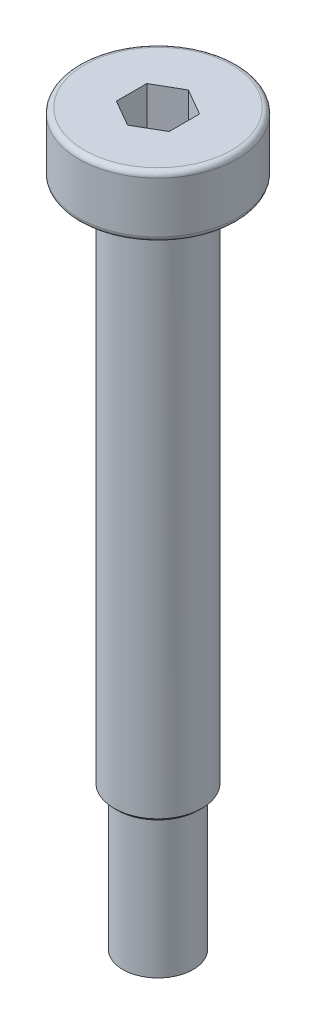
ISO-10303-21;
HEADER;
FILE_DESCRIPTION(('STEP AP214'),'2;1');
FILE_NAME('part.step','',(''),(''),'','','');
FILE_SCHEMA(('AUTOMOTIVE_DESIGN { 1 0 10303 214 1 1 1 1 }'));
ENDSEC;
DATA;
#1=APPLICATION_CONTEXT('core data for automotive mechanical design processes');
#2=APPLICATION_PROTOCOL_DEFINITION('international standard','automotive_design',2000,#1);
#3=PRODUCT_CONTEXT('',#1,'mechanical');
#4=PRODUCT('Part','Part','',(#3));
#5=PRODUCT_RELATED_PRODUCT_CATEGORY('part','',(#4));
#6=PRODUCT_DEFINITION_FORMATION('','',#4);
#7=PRODUCT_DEFINITION_CONTEXT('part definition',#1,'design');
#8=PRODUCT_DEFINITION('design','',#6,#7);
#9=PRODUCT_DEFINITION_SHAPE('','',#8);
#10=(LENGTH_UNIT() NAMED_UNIT(*) SI_UNIT(.MILLI.,.METRE.));
#11=(NAMED_UNIT(*) PLANE_ANGLE_UNIT() SI_UNIT($,.RADIAN.));
#12=(NAMED_UNIT(*) SI_UNIT($,.STERADIAN.) SOLID_ANGLE_UNIT());
#13=UNCERTAINTY_MEASURE_WITH_UNIT(LENGTH_MEASURE(1.E-05),#10,'distance_accuracy_value','');
#14=(GEOMETRIC_REPRESENTATION_CONTEXT(3) GLOBAL_UNCERTAINTY_ASSIGNED_CONTEXT((#13)) GLOBAL_UNIT_ASSIGNED_CONTEXT((#10,
#11,#12)) REPRESENTATION_CONTEXT('',''));
#15=CARTESIAN_POINT('',(0.,0.,0.));
#16=DIRECTION('',(0.,0.,1.));
#17=DIRECTION('',(1.,0.,0.));
#18=AXIS2_PLACEMENT_3D('',#15,#16,#17);
#19=CARTESIAN_POINT('',(0.,3.5,0.));
#20=DIRECTION('',(0.,1.,0.));
#21=DIRECTION('',(-1.,0.,0.));
#22=AXIS2_PLACEMENT_3D('',#19,#20,#21);
#23=PLANE('',#22);
#24=DIRECTION('',(-0.866025403784439,0.,-0.5));
#25=VECTOR('',#24,1.);
#26=CARTESIAN_POINT('',(1.5,3.5,-0.86602540378444));
#27=LINE('',#26,#25);
#28=CARTESIAN_POINT('',(1.5,3.5,-0.86602540378444));
#29=VERTEX_POINT('',#28);
#30=CARTESIAN_POINT('',(0.,3.5,-1.73205080756888));
#31=VERTEX_POINT('',#30);
#32=EDGE_CURVE('E62',#29,#31,#27,.T.);
#33=ORIENTED_EDGE('',*,*,#32,.F.);
#34=DIRECTION('',(0.,0.,-1.));
#35=VECTOR('',#34,1.);
#36=CARTESIAN_POINT('',(1.5,3.5,0.866025403784439));
#37=LINE('',#36,#35);
#38=CARTESIAN_POINT('',(1.5,3.5,0.866025403784439));
#39=VERTEX_POINT('',#38);
#40=EDGE_CURVE('E155',#39,#29,#37,.T.);
#41=ORIENTED_EDGE('',*,*,#40,.F.);
#42=DIRECTION('',(0.866025403784439,0.,-0.5));
#43=VECTOR('',#42,1.);
#44=CARTESIAN_POINT('',(0.,3.5,1.73205080756888));
#45=LINE('',#44,#43);
#46=CARTESIAN_POINT('',(0.,3.5,1.73205080756888));
#47=VERTEX_POINT('',#46);
#48=EDGE_CURVE('E152',#47,#39,#45,.T.);
#49=ORIENTED_EDGE('',*,*,#48,.F.);
#50=DIRECTION('',(0.866025403784438,0.,0.5));
#51=VECTOR('',#50,1.);
#52=CARTESIAN_POINT('',(-1.5,3.5,0.866025403784439));
#53=LINE('',#52,#51);
#54=CARTESIAN_POINT('',(-1.5,3.5,0.866025403784439));
#55=VERTEX_POINT('',#54);
#56=EDGE_CURVE('E110',#55,#47,#53,.T.);
#57=ORIENTED_EDGE('',*,*,#56,.F.);
#58=DIRECTION('',(0.,0.,1.));
#59=VECTOR('',#58,1.);
#60=CARTESIAN_POINT('',(-1.5,3.5,-0.866025403784439));
#61=LINE('',#60,#59);
#62=CARTESIAN_POINT('',(-1.5,3.5,-0.866025403784439));
#63=VERTEX_POINT('',#62);
#64=EDGE_CURVE('E146',#63,#55,#61,.T.);
#65=ORIENTED_EDGE('',*,*,#64,.F.);
#66=DIRECTION('',(-0.866025403784439,0.,0.5));
#67=VECTOR('',#66,1.);
#68=CARTESIAN_POINT('',(0.,3.5,-1.73205080756888));
#69=LINE('',#68,#67);
#70=EDGE_CURVE('E142',#31,#63,#69,.T.);
#71=ORIENTED_EDGE('',*,*,#70,.F.);
#72=EDGE_LOOP('',(#33,#41,#49,#57,#65,#71));
#73=FACE_BOUND('',#72,.T.);
#74=CARTESIAN_POINT('',(0.,3.5,0.));
#75=DIRECTION('',(0.,1.,0.));
#76=DIRECTION('',(-1.,0.,0.));
#77=AXIS2_PLACEMENT_3D('',#74,#75,#76);
#78=CIRCLE('',#77,4.2);
#79=CARTESIAN_POINT('',(-4.2,3.5,0.));
#80=VERTEX_POINT('',#79);
#81=EDGE_CURVE('E194',#80,#80,#78,.T.);
#82=ORIENTED_EDGE('',*,*,#81,.T.);
#83=EDGE_LOOP('',(#82));
#84=FACE_BOUND('',#83,.T.);
#85=ADVANCED_FACE('F45',(#73,#84),#23,.T.);
#86=CARTESIAN_POINT('',(0.,3.5,0.));
#87=DIRECTION('',(0.,1.,0.));
#88=DIRECTION('',(-1.,0.,0.));
#89=AXIS2_PLACEMENT_3D('',#86,#87,#88);
#90=CYLINDRICAL_SURFACE('',#89,4.5);
#91=CARTESIAN_POINT('',(0.,0.3,0.));
#92=DIRECTION('',(0.,-1.,0.));
#93=DIRECTION('',(1.,0.,0.));
#94=AXIS2_PLACEMENT_3D('',#91,#92,#93);
#95=CIRCLE('',#94,4.5);
#96=CARTESIAN_POINT('',(4.5,0.3,0.));
#97=VERTEX_POINT('',#96);
#98=EDGE_CURVE('E186',#97,#97,#95,.F.);
#99=ORIENTED_EDGE('',*,*,#98,.T.);
#100=EDGE_LOOP('',(#99));
#101=FACE_BOUND('',#100,.T.);
#102=CARTESIAN_POINT('',(0.,3.2,0.));
#103=DIRECTION('',(0.,1.,0.));
#104=DIRECTION('',(-1.,0.,0.));
#105=AXIS2_PLACEMENT_3D('',#102,#103,#104);
#106=CIRCLE('',#105,4.5);
#107=CARTESIAN_POINT('',(-4.5,3.2,0.));
#108=VERTEX_POINT('',#107);
#109=EDGE_CURVE('E182',#108,#108,#106,.F.);
#110=ORIENTED_EDGE('',*,*,#109,.T.);
#111=EDGE_LOOP('',(#110));
#112=FACE_BOUND('',#111,.T.);
#113=ADVANCED_FACE('F213',(#101,#112),#90,.T.);
#114=CARTESIAN_POINT('',(-4.5,0.,0.));
#115=DIRECTION('',(0.,-1.,0.));
#116=DIRECTION('',(1.,0.,0.));
#117=AXIS2_PLACEMENT_3D('',#114,#115,#116);
#118=PLANE('',#117);
#119=CARTESIAN_POINT('',(0.,0.,0.));
#120=DIRECTION('',(0.,-1.,0.));
#121=DIRECTION('',(1.,0.,0.));
#122=AXIS2_PLACEMENT_3D('',#119,#120,#121);
#123=CIRCLE('',#122,4.2);
#124=CARTESIAN_POINT('',(4.2,0.,0.));
#125=VERTEX_POINT('',#124);
#126=EDGE_CURVE('E190',#125,#125,#123,.T.);
#127=ORIENTED_EDGE('',*,*,#126,.T.);
#128=EDGE_LOOP('',(#127));
#129=FACE_BOUND('',#128,.T.);
#130=CARTESIAN_POINT('',(0.,0.,0.));
#131=DIRECTION('',(0.,1.,0.));
#132=DIRECTION('',(-1.,0.,0.));
#133=AXIS2_PLACEMENT_3D('',#130,#131,#132);
#134=CIRCLE('',#133,2.5);
#135=CARTESIAN_POINT('',(-2.5,0.,0.));
#136=VERTEX_POINT('',#135);
#137=EDGE_CURVE('E178',#136,#136,#134,.T.);
#138=ORIENTED_EDGE('',*,*,#137,.T.);
#139=EDGE_LOOP('',(#138));
#140=FACE_BOUND('',#139,.T.);
#141=ADVANCED_FACE('F219',(#129,#140),#118,.T.);
#142=CARTESIAN_POINT('',(0.,3.5,0.));
#143=DIRECTION('',(0.,1.,0.));
#144=DIRECTION('',(-1.,0.,0.));
#145=AXIS2_PLACEMENT_3D('',#142,#143,#144);
#146=CYLINDRICAL_SURFACE('',#145,2.5);
#147=CARTESIAN_POINT('',(0.,-29.8,0.));
#148=DIRECTION('',(0.,-1.,0.));
#149=DIRECTION('',(1.,0.,0.));
#150=AXIS2_PLACEMENT_3D('',#147,#148,#149);
#151=CIRCLE('',#150,2.5);
#152=CARTESIAN_POINT('',(2.5,-29.8,0.));
#153=VERTEX_POINT('',#152);
#154=EDGE_CURVE('E55',#153,#153,#151,.F.);
#155=ORIENTED_EDGE('',*,*,#154,.T.);
#156=EDGE_LOOP('',(#155));
#157=FACE_BOUND('',#156,.T.);
#158=ORIENTED_EDGE('',*,*,#137,.F.);
#159=EDGE_LOOP('',(#158));
#160=FACE_BOUND('',#159,.T.);
#161=ADVANCED_FACE('F201',(#157,#160),#146,.T.);
#162=CARTESIAN_POINT('',(-2.5,-30.,0.));
#163=DIRECTION('',(0.,-1.,0.));
#164=DIRECTION('',(1.,0.,0.));
#165=AXIS2_PLACEMENT_3D('',#162,#163,#164);
#166=PLANE('',#165);
#167=CARTESIAN_POINT('',(0.,-30.,0.));
#168=DIRECTION('',(0.,-1.,0.));
#169=DIRECTION('',(1.,0.,0.));
#170=AXIS2_PLACEMENT_3D('',#167,#168,#169);
#171=CIRCLE('',#170,2.3);
#172=CARTESIAN_POINT('',(2.3,-30.,0.));
#173=VERTEX_POINT('',#172);
#174=EDGE_CURVE('E11',#173,#173,#171,.T.);
#175=ORIENTED_EDGE('',*,*,#174,.T.);
#176=EDGE_LOOP('',(#175));
#177=FACE_BOUND('',#176,.T.);
#178=CARTESIAN_POINT('',(0.,-30.,0.));
#179=DIRECTION('',(0.,1.,0.));
#180=DIRECTION('',(-1.,0.,0.));
#181=AXIS2_PLACEMENT_3D('',#178,#179,#180);
#182=CIRCLE('',#181,2.00000000000001);
#183=CARTESIAN_POINT('',(-2.00000000000001,-30.,0.));
#184=VERTEX_POINT('',#183);
#185=EDGE_CURVE('E174',#184,#184,#182,.T.);
#186=ORIENTED_EDGE('',*,*,#185,.T.);
#187=EDGE_LOOP('',(#186));
#188=FACE_BOUND('',#187,.T.);
#189=ADVANCED_FACE('F255',(#177,#188),#166,.T.);
#190=CARTESIAN_POINT('',(0.,3.5,0.));
#191=DIRECTION('',(0.,1.,0.));
#192=DIRECTION('',(-1.,0.,0.));
#193=AXIS2_PLACEMENT_3D('',#190,#191,#192);
#194=CYLINDRICAL_SURFACE('',#193,2.00000000000001);
#195=CARTESIAN_POINT('',(0.,-38.,0.));
#196=DIRECTION('',(0.,1.,0.));
#197=DIRECTION('',(-1.,0.,0.));
#198=AXIS2_PLACEMENT_3D('',#195,#196,#197);
#199=CIRCLE('',#198,2.00000000000001);
#200=CARTESIAN_POINT('',(-2.00000000000001,-38.,0.));
#201=VERTEX_POINT('',#200);
#202=EDGE_CURVE('E161',#201,#201,#199,.T.);
#203=ORIENTED_EDGE('',*,*,#202,.T.);
#204=EDGE_LOOP('',(#203));
#205=FACE_BOUND('',#204,.T.);
#206=ORIENTED_EDGE('',*,*,#185,.F.);
#207=EDGE_LOOP('',(#206));
#208=FACE_BOUND('',#207,.T.);
#209=ADVANCED_FACE('F251',(#205,#208),#194,.T.);
#210=CARTESIAN_POINT('',(-2.00000000000001,-38.,0.));
#211=DIRECTION('',(0.,-1.,0.));
#212=DIRECTION('',(1.,0.,0.));
#213=AXIS2_PLACEMENT_3D('',#210,#211,#212);
#214=PLANE('',#213);
#215=ORIENTED_EDGE('',*,*,#202,.F.);
#216=EDGE_LOOP('',(#215));
#217=FACE_BOUND('',#216,.T.);
#218=ADVANCED_FACE('F228',(#217),#214,.T.);
#219=CARTESIAN_POINT('',(0.,0.3,0.));
#220=DIRECTION('',(0.,-1.,0.));
#221=DIRECTION('',(1.,0.,0.));
#222=AXIS2_PLACEMENT_3D('',#219,#220,#221);
#223=TOROIDAL_SURFACE('',#222,4.2,0.3);
#224=ORIENTED_EDGE('',*,*,#126,.F.);
#225=EDGE_LOOP('',(#224));
#226=FACE_BOUND('',#225,.T.);
#227=ORIENTED_EDGE('',*,*,#98,.F.);
#228=EDGE_LOOP('',(#227));
#229=FACE_BOUND('',#228,.T.);
#230=ADVANCED_FACE('F225',(#226,#229),#223,.T.);
#231=CARTESIAN_POINT('',(0.,3.2,0.));
#232=DIRECTION('',(0.,1.,0.));
#233=DIRECTION('',(-1.,0.,0.));
#234=AXIS2_PLACEMENT_3D('',#231,#232,#233);
#235=TOROIDAL_SURFACE('',#234,4.2,0.3);
#236=ORIENTED_EDGE('',*,*,#109,.F.);
#237=EDGE_LOOP('',(#236));
#238=FACE_BOUND('',#237,.T.);
#239=ORIENTED_EDGE('',*,*,#81,.F.);
#240=EDGE_LOOP('',(#239));
#241=FACE_BOUND('',#240,.T.);
#242=ADVANCED_FACE('F227',(#238,#241),#235,.T.);
#243=CARTESIAN_POINT('',(1.5,1.1,-0.86602540378444));
#244=DIRECTION('',(0.5,0.,-0.866025403784439));
#245=DIRECTION('',(-0.866025403784439,0.,-0.5));
#246=AXIS2_PLACEMENT_3D('',#243,#244,#245);
#247=PLANE('',#246);
#248=ORIENTED_EDGE('',*,*,#32,.T.);
#249=DIRECTION('',(0.,1.,0.));
#250=VECTOR('',#249,1.);
#251=CARTESIAN_POINT('',(0.,1.1,-1.73205080756888));
#252=LINE('',#251,#250);
#253=CARTESIAN_POINT('',(0.,1.1,-1.73205080756888));
#254=VERTEX_POINT('',#253);
#255=EDGE_CURVE('E92',#254,#31,#252,.T.);
#256=ORIENTED_EDGE('',*,*,#255,.F.);
#257=DIRECTION('',(-0.866025403784439,0.,-0.5));
#258=VECTOR('',#257,1.);
#259=CARTESIAN_POINT('',(1.5,1.1,-0.86602540378444));
#260=LINE('',#259,#258);
#261=CARTESIAN_POINT('',(1.5,1.1,-0.86602540378444));
#262=VERTEX_POINT('',#261);
#263=EDGE_CURVE('E158',#262,#254,#260,.T.);
#264=ORIENTED_EDGE('',*,*,#263,.F.);
#265=DIRECTION('',(0.,1.,0.));
#266=VECTOR('',#265,1.);
#267=CARTESIAN_POINT('',(1.5,1.1,-0.86602540378444));
#268=LINE('',#267,#266);
#269=EDGE_CURVE('E70',#262,#29,#268,.T.);
#270=ORIENTED_EDGE('',*,*,#269,.T.);
#271=EDGE_LOOP('',(#248,#256,#264,#270));
#272=FACE_BOUND('',#271,.T.);
#273=ADVANCED_FACE('F231',(#272),#247,.F.);
#274=CARTESIAN_POINT('',(1.5,1.1,0.866025403784439));
#275=DIRECTION('',(1.,0.,0.));
#276=DIRECTION('',(0.,1.,0.));
#277=AXIS2_PLACEMENT_3D('',#274,#275,#276);
#278=PLANE('',#277);
#279=ORIENTED_EDGE('',*,*,#40,.T.);
#280=ORIENTED_EDGE('',*,*,#269,.F.);
#281=DIRECTION('',(0.,0.,-1.));
#282=VECTOR('',#281,1.);
#283=CARTESIAN_POINT('',(1.5,1.1,0.866025403784439));
#284=LINE('',#283,#282);
#285=CARTESIAN_POINT('',(1.5,1.1,0.866025403784439));
#286=VERTEX_POINT('',#285);
#287=EDGE_CURVE('E124',#286,#262,#284,.T.);
#288=ORIENTED_EDGE('',*,*,#287,.F.);
#289=DIRECTION('',(0.,1.,0.));
#290=VECTOR('',#289,1.);
#291=CARTESIAN_POINT('',(1.5,1.1,0.866025403784439));
#292=LINE('',#291,#290);
#293=EDGE_CURVE('E115',#286,#39,#292,.T.);
#294=ORIENTED_EDGE('',*,*,#293,.T.);
#295=EDGE_LOOP('',(#279,#280,#288,#294));
#296=FACE_BOUND('',#295,.T.);
#297=ADVANCED_FACE('F236',(#296),#278,.F.);
#298=CARTESIAN_POINT('',(0.,1.1,1.73205080756888));
#299=DIRECTION('',(0.5,0.,0.866025403784439));
#300=DIRECTION('',(0.866025403784439,0.,-0.5));
#301=AXIS2_PLACEMENT_3D('',#298,#299,#300);
#302=PLANE('',#301);
#303=ORIENTED_EDGE('',*,*,#48,.T.);
#304=ORIENTED_EDGE('',*,*,#293,.F.);
#305=DIRECTION('',(0.866025403784439,0.,-0.5));
#306=VECTOR('',#305,1.);
#307=CARTESIAN_POINT('',(0.,1.1,1.73205080756888));
#308=LINE('',#307,#306);
#309=CARTESIAN_POINT('',(0.,1.1,1.73205080756888));
#310=VERTEX_POINT('',#309);
#311=EDGE_CURVE('E119',#310,#286,#308,.T.);
#312=ORIENTED_EDGE('',*,*,#311,.F.);
#313=DIRECTION('',(0.,1.,0.));
#314=VECTOR('',#313,1.);
#315=CARTESIAN_POINT('',(0.,1.1,1.73205080756888));
#316=LINE('',#315,#314);
#317=EDGE_CURVE('E103',#310,#47,#316,.T.);
#318=ORIENTED_EDGE('',*,*,#317,.T.);
#319=EDGE_LOOP('',(#303,#304,#312,#318));
#320=FACE_BOUND('',#319,.T.);
#321=ADVANCED_FACE('F120',(#320),#302,.F.);
#322=CARTESIAN_POINT('',(-1.5,1.1,0.866025403784439));
#323=DIRECTION('',(-0.5,0.,0.866025403784439));
#324=DIRECTION('',(0.866025403784439,0.,0.5));
#325=AXIS2_PLACEMENT_3D('',#322,#323,#324);
#326=PLANE('',#325);
#327=ORIENTED_EDGE('',*,*,#56,.T.);
#328=ORIENTED_EDGE('',*,*,#317,.F.);
#329=DIRECTION('',(0.866025403784438,0.,0.5));
#330=VECTOR('',#329,1.);
#331=CARTESIAN_POINT('',(-1.5,1.1,0.866025403784439));
#332=LINE('',#331,#330);
#333=CARTESIAN_POINT('',(-1.5,1.1,0.866025403784439));
#334=VERTEX_POINT('',#333);
#335=EDGE_CURVE('E107',#334,#310,#332,.T.);
#336=ORIENTED_EDGE('',*,*,#335,.F.);
#337=DIRECTION('',(0.,1.,0.));
#338=VECTOR('',#337,1.);
#339=CARTESIAN_POINT('',(-1.5,1.1,0.866025403784439));
#340=LINE('',#339,#338);
#341=EDGE_CURVE('E116',#334,#55,#340,.T.);
#342=ORIENTED_EDGE('',*,*,#341,.T.);
#343=EDGE_LOOP('',(#327,#328,#336,#342));
#344=FACE_BOUND('',#343,.T.);
#345=ADVANCED_FACE('F105',(#344),#326,.F.);
#346=CARTESIAN_POINT('',(-1.5,1.1,-0.866025403784439));
#347=DIRECTION('',(-1.,0.,0.));
#348=DIRECTION('',(0.,-1.,0.));
#349=AXIS2_PLACEMENT_3D('',#346,#347,#348);
#350=PLANE('',#349);
#351=ORIENTED_EDGE('',*,*,#64,.T.);
#352=ORIENTED_EDGE('',*,*,#341,.F.);
#353=DIRECTION('',(0.,0.,1.));
#354=VECTOR('',#353,1.);
#355=CARTESIAN_POINT('',(-1.5,1.1,-0.866025403784439));
#356=LINE('',#355,#354);
#357=CARTESIAN_POINT('',(-1.5,1.1,-0.866025403784439));
#358=VERTEX_POINT('',#357);
#359=EDGE_CURVE('E130',#358,#334,#356,.T.);
#360=ORIENTED_EDGE('',*,*,#359,.F.);
#361=DIRECTION('',(0.,1.,0.));
#362=VECTOR('',#361,1.);
#363=CARTESIAN_POINT('',(-1.5,1.1,-0.866025403784439));
#364=LINE('',#363,#362);
#365=EDGE_CURVE('E166',#358,#63,#364,.T.);
#366=ORIENTED_EDGE('',*,*,#365,.T.);
#367=EDGE_LOOP('',(#351,#352,#360,#366));
#368=FACE_BOUND('',#367,.T.);
#369=ADVANCED_FACE('F331',(#368),#350,.F.);
#370=CARTESIAN_POINT('',(0.,1.1,-1.73205080756888));
#371=DIRECTION('',(-0.5,0.,-0.866025403784439));
#372=DIRECTION('',(-0.866025403784439,0.,0.5));
#373=AXIS2_PLACEMENT_3D('',#370,#371,#372);
#374=PLANE('',#373);
#375=ORIENTED_EDGE('',*,*,#70,.T.);
#376=ORIENTED_EDGE('',*,*,#365,.F.);
#377=DIRECTION('',(-0.866025403784439,0.,0.5));
#378=VECTOR('',#377,1.);
#379=CARTESIAN_POINT('',(0.,1.1,-1.73205080756888));
#380=LINE('',#379,#378);
#381=EDGE_CURVE('E134',#254,#358,#380,.T.);
#382=ORIENTED_EDGE('',*,*,#381,.F.);
#383=ORIENTED_EDGE('',*,*,#255,.T.);
#384=EDGE_LOOP('',(#375,#376,#382,#383));
#385=FACE_BOUND('',#384,.T.);
#386=ADVANCED_FACE('F209',(#385),#374,.F.);
#387=CARTESIAN_POINT('',(0.,1.1,0.));
#388=DIRECTION('',(0.,1.,0.));
#389=DIRECTION('',(0.,0.,1.));
#390=AXIS2_PLACEMENT_3D('',#387,#388,#389);
#391=PLANE('',#390);
#392=ORIENTED_EDGE('',*,*,#263,.T.);
#393=ORIENTED_EDGE('',*,*,#381,.T.);
#394=ORIENTED_EDGE('',*,*,#359,.T.);
#395=ORIENTED_EDGE('',*,*,#335,.T.);
#396=ORIENTED_EDGE('',*,*,#311,.T.);
#397=ORIENTED_EDGE('',*,*,#287,.T.);
#398=EDGE_LOOP('',(#392,#393,#394,#395,#396,#397));
#399=FACE_BOUND('',#398,.T.);
#400=ADVANCED_FACE('F127',(#399),#391,.T.);
#401=CARTESIAN_POINT('',(0.,-29.8,0.));
#402=DIRECTION('',(0.,1.,0.));
#403=DIRECTION('',(-1.,0.,0.));
#404=AXIS2_PLACEMENT_3D('',#401,#402,#403);
#405=CONICAL_SURFACE('',#404,2.5,0.785398163397445);
#406=ORIENTED_EDGE('',*,*,#174,.F.);
#407=EDGE_LOOP('',(#406));
#408=FACE_BOUND('',#407,.T.);
#409=ORIENTED_EDGE('',*,*,#154,.F.);
#410=EDGE_LOOP('',(#409));
#411=FACE_BOUND('',#410,.T.);
#412=ADVANCED_FACE('F48',(#408,#411),#405,.T.);
#413=CLOSED_SHELL('',(#85,#113,#141,#161,#189,#209,#218,#230,#242,#273,#297,#321,#345,#369,#386,
#400,#412));
#414=MANIFOLD_SOLID_BREP('B2',#413);
#415=ADVANCED_BREP_SHAPE_REPRESENTATION('',(#18,#414),#14);
#416=SHAPE_DEFINITION_REPRESENTATION(#9,#415);
ENDSEC;
END-ISO-10303-21;
